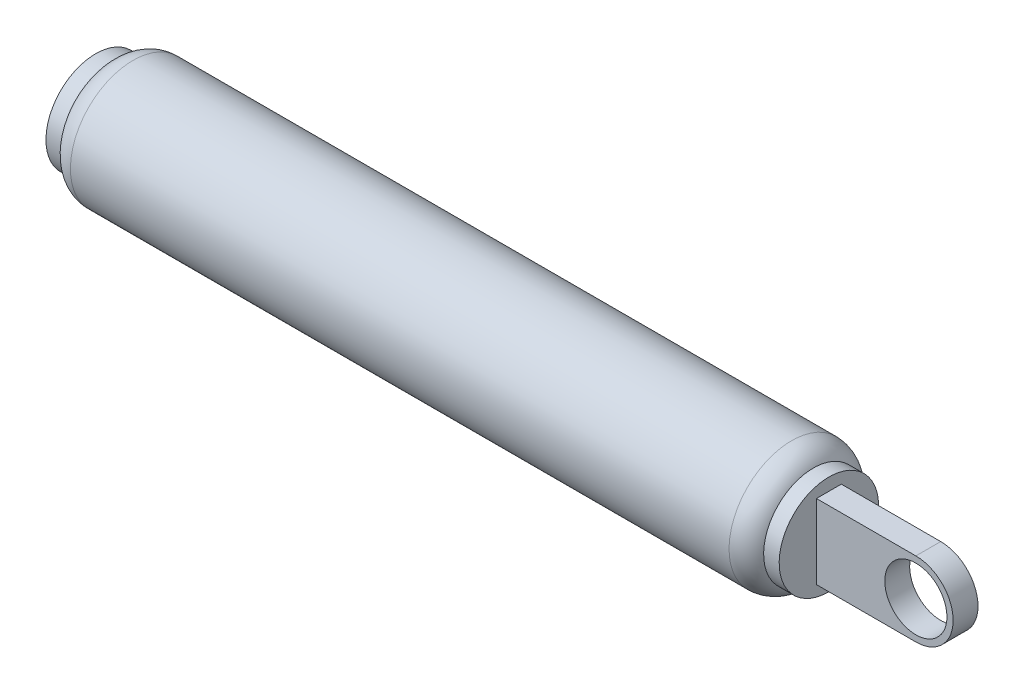
ISO-10303-21;
HEADER;
FILE_DESCRIPTION(('STEP AP214'),'2;1');
FILE_NAME('part.step','',(''),(''),'','','');
FILE_SCHEMA(('AUTOMOTIVE_DESIGN { 1 0 10303 214 1 1 1 1 }'));
ENDSEC;
DATA;
#1=APPLICATION_CONTEXT('core data for automotive mechanical design processes');
#2=APPLICATION_PROTOCOL_DEFINITION('international standard','automotive_design',2000,#1);
#3=PRODUCT_CONTEXT('',#1,'mechanical');
#4=PRODUCT('Part','Part','',(#3));
#5=PRODUCT_RELATED_PRODUCT_CATEGORY('part','',(#4));
#6=PRODUCT_DEFINITION_FORMATION('','',#4);
#7=PRODUCT_DEFINITION_CONTEXT('part definition',#1,'design');
#8=PRODUCT_DEFINITION('design','',#6,#7);
#9=PRODUCT_DEFINITION_SHAPE('','',#8);
#10=(LENGTH_UNIT() NAMED_UNIT(*) SI_UNIT(.MILLI.,.METRE.));
#11=(NAMED_UNIT(*) PLANE_ANGLE_UNIT() SI_UNIT($,.RADIAN.));
#12=(NAMED_UNIT(*) SI_UNIT($,.STERADIAN.) SOLID_ANGLE_UNIT());
#13=UNCERTAINTY_MEASURE_WITH_UNIT(LENGTH_MEASURE(1.E-05),#10,'distance_accuracy_value','');
#14=(GEOMETRIC_REPRESENTATION_CONTEXT(3) GLOBAL_UNCERTAINTY_ASSIGNED_CONTEXT((#13)) GLOBAL_UNIT_ASSIGNED_CONTEXT((#10,
#11,#12)) REPRESENTATION_CONTEXT('',''));
#15=CARTESIAN_POINT('',(0.,0.,0.));
#16=DIRECTION('',(0.,0.,1.));
#17=DIRECTION('',(1.,0.,0.));
#18=AXIS2_PLACEMENT_3D('',#15,#16,#17);
#19=CARTESIAN_POINT('',(29.5,0.,0.));
#20=DIRECTION('',(-1.,0.,0.));
#21=DIRECTION('',(0.,-1.,0.));
#22=AXIS2_PLACEMENT_3D('',#19,#20,#21);
#23=CYLINDRICAL_SURFACE('',#22,4.);
#24=CARTESIAN_POINT('',(29.5,0.,0.));
#25=DIRECTION('',(-1.,0.,0.));
#26=DIRECTION('',(0.,-1.,0.));
#27=AXIS2_PLACEMENT_3D('',#24,#25,#26);
#28=CIRCLE('',#27,4.);
#29=CARTESIAN_POINT('',(29.5,-4.,0.));
#30=VERTEX_POINT('',#29);
#31=EDGE_CURVE('E11',#30,#30,#28,.T.);
#32=ORIENTED_EDGE('',*,*,#31,.T.);
#33=EDGE_LOOP('',(#32));
#34=FACE_BOUND('',#33,.T.);
#35=CARTESIAN_POINT('',(28.25,0.,0.));
#36=DIRECTION('',(-1.,0.,0.));
#37=DIRECTION('',(0.,-1.,0.));
#38=AXIS2_PLACEMENT_3D('',#35,#36,#37);
#39=CIRCLE('',#38,4.);
#40=CARTESIAN_POINT('',(28.25,-4.,0.));
#41=VERTEX_POINT('',#40);
#42=EDGE_CURVE('E109',#41,#41,#39,.T.);
#43=ORIENTED_EDGE('',*,*,#42,.F.);
#44=EDGE_LOOP('',(#43));
#45=FACE_BOUND('',#44,.T.);
#46=ADVANCED_FACE('F39',(#34,#45),#23,.T.);
#47=CARTESIAN_POINT('',(29.5,4.,0.));
#48=DIRECTION('',(1.,0.,0.));
#49=DIRECTION('',(0.,1.,0.));
#50=AXIS2_PLACEMENT_3D('',#47,#48,#49);
#51=PLANE('',#50);
#52=DIRECTION('',(0.,-1.,0.));
#53=VECTOR('',#52,1.);
#54=CARTESIAN_POINT('',(29.5,3.,1.));
#55=LINE('',#54,#53);
#56=CARTESIAN_POINT('',(29.5,3.,1.));
#57=VERTEX_POINT('',#56);
#58=CARTESIAN_POINT('',(29.5,-3.,1.));
#59=VERTEX_POINT('',#58);
#60=EDGE_CURVE('E102',#57,#59,#55,.T.);
#61=ORIENTED_EDGE('',*,*,#60,.F.);
#62=DIRECTION('',(0.,0.,1.));
#63=VECTOR('',#62,1.);
#64=CARTESIAN_POINT('',(29.5,3.,-1.));
#65=LINE('',#64,#63);
#66=CARTESIAN_POINT('',(29.5,3.,-1.));
#67=VERTEX_POINT('',#66);
#68=EDGE_CURVE('E95',#67,#57,#65,.T.);
#69=ORIENTED_EDGE('',*,*,#68,.F.);
#70=DIRECTION('',(0.,-1.,0.));
#71=VECTOR('',#70,1.);
#72=CARTESIAN_POINT('',(29.5,3.,-1.));
#73=LINE('',#72,#71);
#74=CARTESIAN_POINT('',(29.5,-3.,-1.));
#75=VERTEX_POINT('',#74);
#76=EDGE_CURVE('E86',#67,#75,#73,.T.);
#77=ORIENTED_EDGE('',*,*,#76,.T.);
#78=DIRECTION('',(0.,0.,1.));
#79=VECTOR('',#78,1.);
#80=CARTESIAN_POINT('',(29.5,-3.,-1.));
#81=LINE('',#80,#79);
#82=EDGE_CURVE('E103',#75,#59,#81,.T.);
#83=ORIENTED_EDGE('',*,*,#82,.T.);
#84=EDGE_LOOP('',(#61,#69,#77,#83));
#85=FACE_BOUND('',#84,.T.);
#86=ORIENTED_EDGE('',*,*,#31,.F.);
#87=EDGE_LOOP('',(#86));
#88=FACE_BOUND('',#87,.T.);
#89=ADVANCED_FACE('F100',(#85,#88),#51,.T.);
#90=CARTESIAN_POINT('',(-29.5,0.,0.));
#91=DIRECTION('',(-1.,0.,0.));
#92=DIRECTION('',(0.,-1.,0.));
#93=AXIS2_PLACEMENT_3D('',#90,#91,#92);
#94=PLANE('',#93);
#95=CARTESIAN_POINT('',(-29.5,0.,0.));
#96=DIRECTION('',(-1.,0.,0.));
#97=DIRECTION('',(0.,0.,1.));
#98=AXIS2_PLACEMENT_3D('',#95,#96,#97);
#99=CIRCLE('',#98,2.99999999999999);
#100=CARTESIAN_POINT('',(-29.5,0.,2.99999999999999));
#101=VERTEX_POINT('',#100);
#102=EDGE_CURVE('E199',#101,#101,#99,.T.);
#103=ORIENTED_EDGE('',*,*,#102,.F.);
#104=EDGE_LOOP('',(#103));
#105=FACE_BOUND('',#104,.T.);
#106=CARTESIAN_POINT('',(-29.5,0.,0.));
#107=DIRECTION('',(-1.,0.,0.));
#108=DIRECTION('',(0.,-1.,0.));
#109=AXIS2_PLACEMENT_3D('',#106,#107,#108);
#110=CIRCLE('',#109,4.);
#111=CARTESIAN_POINT('',(-29.5,-3.99999999999999,0.));
#112=VERTEX_POINT('',#111);
#113=EDGE_CURVE('E46',#112,#112,#110,.T.);
#114=ORIENTED_EDGE('',*,*,#113,.T.);
#115=EDGE_LOOP('',(#114));
#116=FACE_BOUND('',#115,.T.);
#117=ADVANCED_FACE('F123',(#105,#116),#94,.T.);
#118=CARTESIAN_POINT('',(29.5,0.,0.));
#119=DIRECTION('',(-1.,0.,0.));
#120=DIRECTION('',(0.,-1.,0.));
#121=AXIS2_PLACEMENT_3D('',#118,#119,#120);
#122=CYLINDRICAL_SURFACE('',#121,4.);
#123=CARTESIAN_POINT('',(-28.25,0.,0.));
#124=DIRECTION('',(-1.,0.,0.));
#125=DIRECTION('',(0.,-1.,0.));
#126=AXIS2_PLACEMENT_3D('',#123,#124,#125);
#127=CIRCLE('',#126,4.);
#128=CARTESIAN_POINT('',(-28.25,-3.99999999999999,0.));
#129=VERTEX_POINT('',#128);
#130=EDGE_CURVE('E118',#129,#129,#127,.T.);
#131=ORIENTED_EDGE('',*,*,#130,.T.);
#132=EDGE_LOOP('',(#131));
#133=FACE_BOUND('',#132,.T.);
#134=ORIENTED_EDGE('',*,*,#113,.F.);
#135=EDGE_LOOP('',(#134));
#136=FACE_BOUND('',#135,.T.);
#137=ADVANCED_FACE('F125',(#133,#136),#122,.T.);
#138=CARTESIAN_POINT('',(-26.5,0.,0.));
#139=DIRECTION('',(-1.,0.,0.));
#140=DIRECTION('',(0.,-1.,0.));
#141=AXIS2_PLACEMENT_3D('',#138,#139,#140);
#142=TOROIDAL_SURFACE('',#141,3.03175416344815,2.);
#143=CARTESIAN_POINT('',(-26.5,0.,0.));
#144=DIRECTION('',(-1.,0.,0.));
#145=DIRECTION('',(0.,-1.,0.));
#146=AXIS2_PLACEMENT_3D('',#143,#144,#145);
#147=CIRCLE('',#146,5.03175416344814);
#148=CARTESIAN_POINT('',(-26.5,-5.03175416344813,0.));
#149=VERTEX_POINT('',#148);
#150=EDGE_CURVE('E115',#149,#149,#147,.T.);
#151=ORIENTED_EDGE('',*,*,#150,.T.);
#152=EDGE_LOOP('',(#151));
#153=FACE_BOUND('',#152,.T.);
#154=ORIENTED_EDGE('',*,*,#130,.F.);
#155=EDGE_LOOP('',(#154));
#156=FACE_BOUND('',#155,.T.);
#157=ADVANCED_FACE('F127',(#153,#156),#142,.T.);
#158=CARTESIAN_POINT('',(29.5,0.,0.));
#159=DIRECTION('',(-1.,0.,0.));
#160=DIRECTION('',(0.,-1.,0.));
#161=AXIS2_PLACEMENT_3D('',#158,#159,#160);
#162=CYLINDRICAL_SURFACE('',#161,5.03175416344814);
#163=CARTESIAN_POINT('',(26.5,0.,0.));
#164=DIRECTION('',(-1.,0.,0.));
#165=DIRECTION('',(0.,-1.,0.));
#166=AXIS2_PLACEMENT_3D('',#163,#164,#165);
#167=CIRCLE('',#166,5.03175416344814);
#168=CARTESIAN_POINT('',(26.5,-5.03175416344814,0.));
#169=VERTEX_POINT('',#168);
#170=EDGE_CURVE('E112',#169,#169,#167,.T.);
#171=ORIENTED_EDGE('',*,*,#170,.T.);
#172=EDGE_LOOP('',(#171));
#173=FACE_BOUND('',#172,.T.);
#174=ORIENTED_EDGE('',*,*,#150,.F.);
#175=EDGE_LOOP('',(#174));
#176=FACE_BOUND('',#175,.T.);
#177=ADVANCED_FACE('F134',(#173,#176),#162,.T.);
#178=CARTESIAN_POINT('',(26.5,0.,0.));
#179=DIRECTION('',(-1.,0.,0.));
#180=DIRECTION('',(0.,-1.,0.));
#181=AXIS2_PLACEMENT_3D('',#178,#179,#180);
#182=TOROIDAL_SURFACE('',#181,3.03175416344815,2.);
#183=ORIENTED_EDGE('',*,*,#42,.T.);
#184=EDGE_LOOP('',(#183));
#185=FACE_BOUND('',#184,.T.);
#186=ORIENTED_EDGE('',*,*,#170,.F.);
#187=EDGE_LOOP('',(#186));
#188=FACE_BOUND('',#187,.T.);
#189=ADVANCED_FACE('F148',(#185,#188),#182,.T.);
#190=CARTESIAN_POINT('',(37.5,0.,-1.));
#191=DIRECTION('',(0.,0.,1.));
#192=DIRECTION('',(1.,0.,0.));
#193=AXIS2_PLACEMENT_3D('',#190,#191,#192);
#194=CYLINDRICAL_SURFACE('',#193,3.);
#195=CARTESIAN_POINT('',(37.5,0.,1.));
#196=DIRECTION('',(0.,0.,1.));
#197=DIRECTION('',(1.,0.,0.));
#198=AXIS2_PLACEMENT_3D('',#195,#196,#197);
#199=CIRCLE('',#198,3.);
#200=CARTESIAN_POINT('',(37.5,-3.,1.));
#201=VERTEX_POINT('',#200);
#202=CARTESIAN_POINT('',(37.5,3.,1.));
#203=VERTEX_POINT('',#202);
#204=EDGE_CURVE('E207',#201,#203,#199,.T.);
#205=ORIENTED_EDGE('',*,*,#204,.F.);
#206=DIRECTION('',(0.,0.,1.));
#207=VECTOR('',#206,1.);
#208=CARTESIAN_POINT('',(37.5,-3.,-1.));
#209=LINE('',#208,#207);
#210=CARTESIAN_POINT('',(37.5,-3.,-1.));
#211=VERTEX_POINT('',#210);
#212=EDGE_CURVE('E61',#211,#201,#209,.T.);
#213=ORIENTED_EDGE('',*,*,#212,.F.);
#214=CARTESIAN_POINT('',(37.5,0.,-1.));
#215=DIRECTION('',(0.,0.,1.));
#216=DIRECTION('',(1.,0.,0.));
#217=AXIS2_PLACEMENT_3D('',#214,#215,#216);
#218=CIRCLE('',#217,3.);
#219=CARTESIAN_POINT('',(37.5,3.,-1.));
#220=VERTEX_POINT('',#219);
#221=EDGE_CURVE('E97',#211,#220,#218,.T.);
#222=ORIENTED_EDGE('',*,*,#221,.T.);
#223=DIRECTION('',(0.,0.,1.));
#224=VECTOR('',#223,1.);
#225=CARTESIAN_POINT('',(37.5,3.,-1.));
#226=LINE('',#225,#224);
#227=EDGE_CURVE('E80',#220,#203,#226,.T.);
#228=ORIENTED_EDGE('',*,*,#227,.T.);
#229=EDGE_LOOP('',(#205,#213,#222,#228));
#230=FACE_BOUND('',#229,.T.);
#231=ADVANCED_FACE('F151',(#230),#194,.T.);
#232=CARTESIAN_POINT('',(29.5,-3.,-1.));
#233=DIRECTION('',(0.,-1.,0.));
#234=DIRECTION('',(1.,0.,0.));
#235=AXIS2_PLACEMENT_3D('',#232,#233,#234);
#236=PLANE('',#235);
#237=DIRECTION('',(1.,0.,0.));
#238=VECTOR('',#237,1.);
#239=CARTESIAN_POINT('',(29.5,-3.,1.));
#240=LINE('',#239,#238);
#241=EDGE_CURVE('E53',#59,#201,#240,.T.);
#242=ORIENTED_EDGE('',*,*,#241,.F.);
#243=ORIENTED_EDGE('',*,*,#82,.F.);
#244=DIRECTION('',(1.,0.,0.));
#245=VECTOR('',#244,1.);
#246=CARTESIAN_POINT('',(29.5,-3.,-1.));
#247=LINE('',#246,#245);
#248=EDGE_CURVE('E89',#75,#211,#247,.T.);
#249=ORIENTED_EDGE('',*,*,#248,.T.);
#250=ORIENTED_EDGE('',*,*,#212,.T.);
#251=EDGE_LOOP('',(#242,#243,#249,#250));
#252=FACE_BOUND('',#251,.T.);
#253=ADVANCED_FACE('F166',(#252),#236,.T.);
#254=CARTESIAN_POINT('',(37.5,3.,-1.));
#255=DIRECTION('',(0.,1.,0.));
#256=DIRECTION('',(-1.,0.,0.));
#257=AXIS2_PLACEMENT_3D('',#254,#255,#256);
#258=PLANE('',#257);
#259=DIRECTION('',(-1.,0.,0.));
#260=VECTOR('',#259,1.);
#261=CARTESIAN_POINT('',(37.5,3.,1.));
#262=LINE('',#261,#260);
#263=EDGE_CURVE('E212',#203,#57,#262,.T.);
#264=ORIENTED_EDGE('',*,*,#263,.F.);
#265=ORIENTED_EDGE('',*,*,#227,.F.);
#266=DIRECTION('',(-1.,0.,0.));
#267=VECTOR('',#266,1.);
#268=CARTESIAN_POINT('',(37.5,3.,-1.));
#269=LINE('',#268,#267);
#270=EDGE_CURVE('E88',#220,#67,#269,.T.);
#271=ORIENTED_EDGE('',*,*,#270,.T.);
#272=ORIENTED_EDGE('',*,*,#68,.T.);
#273=EDGE_LOOP('',(#264,#265,#271,#272));
#274=FACE_BOUND('',#273,.T.);
#275=ADVANCED_FACE('F94',(#274),#258,.T.);
#276=CARTESIAN_POINT('',(37.5,0.,-1.));
#277=DIRECTION('',(0.,0.,1.));
#278=DIRECTION('',(1.,0.,0.));
#279=AXIS2_PLACEMENT_3D('',#276,#277,#278);
#280=PLANE('',#279);
#281=CARTESIAN_POINT('',(37.5,0.,-1.));
#282=DIRECTION('',(0.,0.,-1.));
#283=DIRECTION('',(-1.,0.,0.));
#284=AXIS2_PLACEMENT_3D('',#281,#282,#283);
#285=CIRCLE('',#284,2.49999999999999);
#286=CARTESIAN_POINT('',(35.,0.,-1.));
#287=VERTEX_POINT('',#286);
#288=EDGE_CURVE('E197',#287,#287,#285,.T.);
#289=ORIENTED_EDGE('',*,*,#288,.F.);
#290=EDGE_LOOP('',(#289));
#291=FACE_BOUND('',#290,.T.);
#292=ORIENTED_EDGE('',*,*,#221,.F.);
#293=ORIENTED_EDGE('',*,*,#248,.F.);
#294=ORIENTED_EDGE('',*,*,#76,.F.);
#295=ORIENTED_EDGE('',*,*,#270,.F.);
#296=EDGE_LOOP('',(#292,#293,#294,#295));
#297=FACE_BOUND('',#296,.T.);
#298=ADVANCED_FACE('F87',(#291,#297),#280,.F.);
#299=CARTESIAN_POINT('',(37.5,0.,1.));
#300=DIRECTION('',(0.,0.,1.));
#301=DIRECTION('',(1.,0.,0.));
#302=AXIS2_PLACEMENT_3D('',#299,#300,#301);
#303=PLANE('',#302);
#304=CARTESIAN_POINT('',(37.5,0.,1.));
#305=DIRECTION('',(0.,0.,1.));
#306=DIRECTION('',(1.,0.,0.));
#307=AXIS2_PLACEMENT_3D('',#304,#305,#306);
#308=CIRCLE('',#307,2.49999999999999);
#309=CARTESIAN_POINT('',(40.,0.,1.));
#310=VERTEX_POINT('',#309);
#311=EDGE_CURVE('E194',#310,#310,#308,.T.);
#312=ORIENTED_EDGE('',*,*,#311,.F.);
#313=EDGE_LOOP('',(#312));
#314=FACE_BOUND('',#313,.T.);
#315=ORIENTED_EDGE('',*,*,#204,.T.);
#316=ORIENTED_EDGE('',*,*,#263,.T.);
#317=ORIENTED_EDGE('',*,*,#60,.T.);
#318=ORIENTED_EDGE('',*,*,#241,.T.);
#319=EDGE_LOOP('',(#315,#316,#317,#318));
#320=FACE_BOUND('',#319,.T.);
#321=ADVANCED_FACE('F171',(#314,#320),#303,.T.);
#322=CARTESIAN_POINT('',(-4.50000000000001,0.,0.));
#323=DIRECTION('',(1.,0.,0.));
#324=DIRECTION('',(0.,0.,-1.));
#325=AXIS2_PLACEMENT_3D('',#322,#323,#324);
#326=PLANE('',#325);
#327=CARTESIAN_POINT('',(-4.5,0.,0.));
#328=DIRECTION('',(-1.,0.,0.));
#329=DIRECTION('',(0.,0.,1.));
#330=AXIS2_PLACEMENT_3D('',#327,#328,#329);
#331=CIRCLE('',#330,2.99999999999999);
#332=CARTESIAN_POINT('',(-4.5,0.,2.99999999999999));
#333=VERTEX_POINT('',#332);
#334=EDGE_CURVE('E204',#333,#333,#331,.T.);
#335=ORIENTED_EDGE('',*,*,#334,.T.);
#336=EDGE_LOOP('',(#335));
#337=FACE_BOUND('',#336,.T.);
#338=ADVANCED_FACE('F174',(#337),#326,.F.);
#339=CARTESIAN_POINT('',(-29.5,0.,0.));
#340=DIRECTION('',(-1.,0.,0.));
#341=DIRECTION('',(0.,0.,1.));
#342=AXIS2_PLACEMENT_3D('',#339,#340,#341);
#343=CYLINDRICAL_SURFACE('',#342,2.99999999999999);
#344=ORIENTED_EDGE('',*,*,#334,.F.);
#345=EDGE_LOOP('',(#344));
#346=FACE_BOUND('',#345,.T.);
#347=ORIENTED_EDGE('',*,*,#102,.T.);
#348=EDGE_LOOP('',(#347));
#349=FACE_BOUND('',#348,.T.);
#350=ADVANCED_FACE('F181',(#346,#349),#343,.F.);
#351=CARTESIAN_POINT('',(37.5,0.,-1.));
#352=DIRECTION('',(0.,0.,-1.));
#353=DIRECTION('',(-1.,0.,0.));
#354=AXIS2_PLACEMENT_3D('',#351,#352,#353);
#355=CYLINDRICAL_SURFACE('',#354,2.49999999999999);
#356=ORIENTED_EDGE('',*,*,#311,.T.);
#357=EDGE_LOOP('',(#356));
#358=FACE_BOUND('',#357,.T.);
#359=ORIENTED_EDGE('',*,*,#288,.T.);
#360=EDGE_LOOP('',(#359));
#361=FACE_BOUND('',#360,.T.);
#362=ADVANCED_FACE('F185',(#358,#361),#355,.F.);
#363=CLOSED_SHELL('',(#46,#89,#117,#137,#157,#177,#189,#231,#253,#275,#298,#321,#338,#350,#362));
#364=MANIFOLD_SOLID_BREP('B2',#363);
#365=ADVANCED_BREP_SHAPE_REPRESENTATION('',(#18,#364),#14);
#366=SHAPE_DEFINITION_REPRESENTATION(#9,#365);
ENDSEC;
END-ISO-10303-21;
